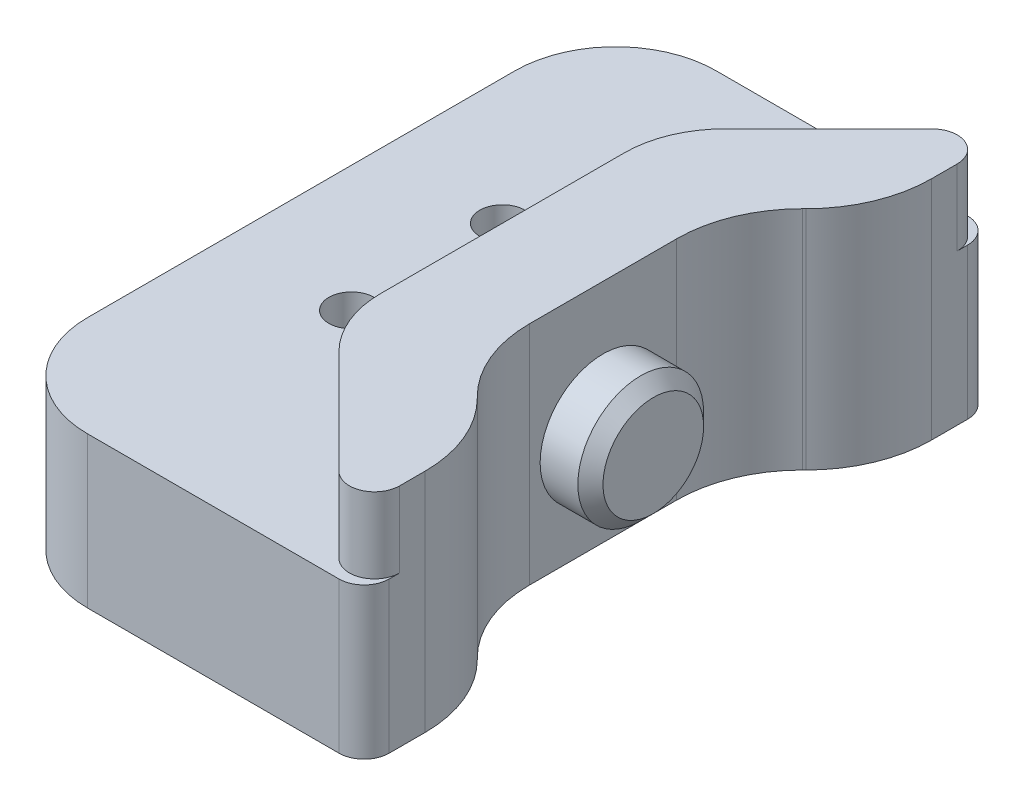
ISO-10303-21;
HEADER;
FILE_DESCRIPTION(('STEP AP214'),'2;1');
FILE_NAME('part.step','',(''),(''),'','','');
FILE_SCHEMA(('AUTOMOTIVE_DESIGN { 1 0 10303 214 1 1 1 1 }'));
ENDSEC;
DATA;
#1=APPLICATION_CONTEXT('core data for automotive mechanical design processes');
#2=APPLICATION_PROTOCOL_DEFINITION('international standard','automotive_design',2000,#1);
#3=PRODUCT_CONTEXT('',#1,'mechanical');
#4=PRODUCT('Part','Part','',(#3));
#5=PRODUCT_RELATED_PRODUCT_CATEGORY('part','',(#4));
#6=PRODUCT_DEFINITION_FORMATION('','',#4);
#7=PRODUCT_DEFINITION_CONTEXT('part definition',#1,'design');
#8=PRODUCT_DEFINITION('design','',#6,#7);
#9=PRODUCT_DEFINITION_SHAPE('','',#8);
#10=(LENGTH_UNIT() NAMED_UNIT(*) SI_UNIT(.MILLI.,.METRE.));
#11=(NAMED_UNIT(*) PLANE_ANGLE_UNIT() SI_UNIT($,.RADIAN.));
#12=(NAMED_UNIT(*) SI_UNIT($,.STERADIAN.) SOLID_ANGLE_UNIT());
#13=UNCERTAINTY_MEASURE_WITH_UNIT(LENGTH_MEASURE(1.E-05),#10,'distance_accuracy_value','');
#14=(GEOMETRIC_REPRESENTATION_CONTEXT(3) GLOBAL_UNCERTAINTY_ASSIGNED_CONTEXT((#13)) GLOBAL_UNIT_ASSIGNED_CONTEXT((#10,
#11,#12)) REPRESENTATION_CONTEXT('',''));
#15=CARTESIAN_POINT('',(0.,0.,0.));
#16=DIRECTION('',(0.,0.,1.));
#17=DIRECTION('',(1.,0.,0.));
#18=AXIS2_PLACEMENT_3D('',#15,#16,#17);
#19=CARTESIAN_POINT('',(0.,6.,0.));
#20=DIRECTION('',(0.,1.,0.));
#21=DIRECTION('',(0.,0.,1.));
#22=AXIS2_PLACEMENT_3D('',#19,#20,#21);
#23=PLANE('',#22);
#24=DIRECTION('',(0.,0.,-1.));
#25=VECTOR('',#24,1.);
#26=CARTESIAN_POINT('',(15.,6.,-8.));
#27=LINE('',#26,#25);
#28=CARTESIAN_POINT('',(15.,6.,-11.0857864376269));
#29=VERTEX_POINT('',#28);
#30=CARTESIAN_POINT('',(15.,6.,-11.5));
#31=VERTEX_POINT('',#30);
#32=EDGE_CURVE('E254',#29,#31,#27,.T.);
#33=ORIENTED_EDGE('',*,*,#32,.T.);
#34=CARTESIAN_POINT('',(14.,6.,-11.5));
#35=DIRECTION('',(0.,1.,0.));
#36=DIRECTION('',(0.,0.,1.));
#37=AXIS2_PLACEMENT_3D('',#34,#35,#36);
#38=CIRCLE('',#37,1.);
#39=CARTESIAN_POINT('',(14.,6.,-12.5));
#40=VERTEX_POINT('',#39);
#41=EDGE_CURVE('E325',#31,#40,#38,.T.);
#42=ORIENTED_EDGE('',*,*,#41,.T.);
#43=DIRECTION('',(-1.,0.,0.));
#44=VECTOR('',#43,1.);
#45=CARTESIAN_POINT('',(15.,6.,-12.5));
#46=LINE('',#45,#44);
#47=CARTESIAN_POINT('',(4.,6.,-12.5));
#48=VERTEX_POINT('',#47);
#49=EDGE_CURVE('E243',#40,#48,#46,.T.);
#50=ORIENTED_EDGE('',*,*,#49,.T.);
#51=CARTESIAN_POINT('',(4.,6.,-8.5));
#52=DIRECTION('',(0.,1.,0.));
#53=DIRECTION('',(0.,0.,1.));
#54=AXIS2_PLACEMENT_3D('',#51,#52,#53);
#55=CIRCLE('',#54,4.);
#56=CARTESIAN_POINT('',(0.,6.,-8.5));
#57=VERTEX_POINT('',#56);
#58=EDGE_CURVE('E290',#48,#57,#55,.T.);
#59=ORIENTED_EDGE('',*,*,#58,.T.);
#60=DIRECTION('',(0.,0.,1.));
#61=VECTOR('',#60,1.);
#62=CARTESIAN_POINT('',(0.,6.,-12.5));
#63=LINE('',#62,#61);
#64=CARTESIAN_POINT('',(0.,6.,8.5));
#65=VERTEX_POINT('',#64);
#66=EDGE_CURVE('E245',#57,#65,#63,.T.);
#67=ORIENTED_EDGE('',*,*,#66,.T.);
#68=CARTESIAN_POINT('',(4.,6.,8.5));
#69=DIRECTION('',(0.,1.,0.));
#70=DIRECTION('',(0.,0.,1.));
#71=AXIS2_PLACEMENT_3D('',#68,#69,#70);
#72=CIRCLE('',#71,4.);
#73=CARTESIAN_POINT('',(4.,6.,12.5));
#74=VERTEX_POINT('',#73);
#75=EDGE_CURVE('E288',#65,#74,#72,.T.);
#76=ORIENTED_EDGE('',*,*,#75,.T.);
#77=DIRECTION('',(1.,0.,0.));
#78=VECTOR('',#77,1.);
#79=CARTESIAN_POINT('',(0.,6.,12.5));
#80=LINE('',#79,#78);
#81=CARTESIAN_POINT('',(14.,6.,12.5));
#82=VERTEX_POINT('',#81);
#83=EDGE_CURVE('E249',#74,#82,#80,.T.);
#84=ORIENTED_EDGE('',*,*,#83,.T.);
#85=CARTESIAN_POINT('',(14.,6.,11.5));
#86=DIRECTION('',(0.,1.,0.));
#87=DIRECTION('',(0.,0.,1.));
#88=AXIS2_PLACEMENT_3D('',#85,#86,#87);
#89=CIRCLE('',#88,1.);
#90=CARTESIAN_POINT('',(15.,6.,11.5));
#91=VERTEX_POINT('',#90);
#92=EDGE_CURVE('E323',#82,#91,#89,.T.);
#93=ORIENTED_EDGE('',*,*,#92,.T.);
#94=DIRECTION('',(0.,0.,-1.));
#95=VECTOR('',#94,1.);
#96=CARTESIAN_POINT('',(15.,6.,12.5));
#97=LINE('',#96,#95);
#98=CARTESIAN_POINT('',(15.,6.,11.0857864376269));
#99=VERTEX_POINT('',#98);
#100=EDGE_CURVE('E252',#91,#99,#97,.T.);
#101=ORIENTED_EDGE('',*,*,#100,.T.);
#102=CARTESIAN_POINT('',(14.,6.,11.0857864376269));
#103=DIRECTION('',(0.,1.,0.));
#104=DIRECTION('',(0.,0.,1.));
#105=AXIS2_PLACEMENT_3D('',#102,#103,#104);
#106=CIRCLE('',#105,1.);
#107=CARTESIAN_POINT('',(13.2928932188135,6.,11.7928932188135));
#108=VERTEX_POINT('',#107);
#109=EDGE_CURVE('E222',#108,#99,#106,.T.);
#110=ORIENTED_EDGE('',*,*,#109,.F.);
#111=DIRECTION('',(0.707106781186547,0.,0.707106781186548));
#112=VECTOR('',#111,1.);
#113=CARTESIAN_POINT('',(8.,6.,6.5));
#114=LINE('',#113,#112);
#115=CARTESIAN_POINT('',(9.17157287525381,6.,7.67157287525381));
#116=VERTEX_POINT('',#115);
#117=EDGE_CURVE('E218',#116,#108,#114,.T.);
#118=ORIENTED_EDGE('',*,*,#117,.F.);
#119=CARTESIAN_POINT('',(12.,6.,4.84314575050762));
#120=DIRECTION('',(0.,1.,0.));
#121=DIRECTION('',(0.,0.,1.));
#122=AXIS2_PLACEMENT_3D('',#119,#120,#121);
#123=CIRCLE('',#122,4.);
#124=CARTESIAN_POINT('',(8.,6.,4.84314575050762));
#125=VERTEX_POINT('',#124);
#126=EDGE_CURVE('E311',#116,#125,#123,.F.);
#127=ORIENTED_EDGE('',*,*,#126,.T.);
#128=DIRECTION('',(0.,0.,1.));
#129=VECTOR('',#128,1.);
#130=CARTESIAN_POINT('',(8.,6.,-6.5));
#131=LINE('',#130,#129);
#132=CARTESIAN_POINT('',(8.,6.,-4.84314575050762));
#133=VERTEX_POINT('',#132);
#134=EDGE_CURVE('E482',#133,#125,#131,.T.);
#135=ORIENTED_EDGE('',*,*,#134,.F.);
#136=CARTESIAN_POINT('',(12.,6.,-4.84314575050762));
#137=DIRECTION('',(0.,1.,0.));
#138=DIRECTION('',(0.,0.,1.));
#139=AXIS2_PLACEMENT_3D('',#136,#137,#138);
#140=CIRCLE('',#139,4.);
#141=CARTESIAN_POINT('',(9.17157287525382,6.,-7.67157287525381));
#142=VERTEX_POINT('',#141);
#143=EDGE_CURVE('E309',#133,#142,#140,.F.);
#144=ORIENTED_EDGE('',*,*,#143,.T.);
#145=DIRECTION('',(-0.707106781186548,0.,0.707106781186547));
#146=VECTOR('',#145,1.);
#147=CARTESIAN_POINT('',(13.2928932188135,6.,-11.7928932188135));
#148=LINE('',#147,#146);
#149=CARTESIAN_POINT('',(13.2928932188135,6.,-11.7928932188135));
#150=VERTEX_POINT('',#149);
#151=EDGE_CURVE('E477',#150,#142,#148,.T.);
#152=ORIENTED_EDGE('',*,*,#151,.F.);
#153=CARTESIAN_POINT('',(14.,6.,-11.0857864376269));
#154=DIRECTION('',(0.,1.,0.));
#155=DIRECTION('',(0.,0.,-1.));
#156=AXIS2_PLACEMENT_3D('',#153,#154,#155);
#157=CIRCLE('',#156,1.);
#158=EDGE_CURVE('E475',#29,#150,#157,.T.);
#159=ORIENTED_EDGE('',*,*,#158,.F.);
#160=EDGE_LOOP('',(#33,#42,#50,#59,#67,#76,#84,#93,#101,#110,#118,#127,#135,#144,#152,#159));
#161=FACE_BOUND('',#160,.T.);
#162=CARTESIAN_POINT('',(5.,6.,3.));
#163=DIRECTION('',(0.,1.,0.));
#164=DIRECTION('',(0.,0.,1.));
#165=AXIS2_PLACEMENT_3D('',#162,#163,#164);
#166=CIRCLE('',#165,0.9);
#167=CARTESIAN_POINT('',(5.,6.,3.9));
#168=VERTEX_POINT('',#167);
#169=EDGE_CURVE('E237',#168,#168,#166,.T.);
#170=ORIENTED_EDGE('',*,*,#169,.F.);
#171=EDGE_LOOP('',(#170));
#172=FACE_BOUND('',#171,.T.);
#173=CARTESIAN_POINT('',(5.,6.,-3.));
#174=DIRECTION('',(0.,1.,0.));
#175=DIRECTION('',(0.,0.,1.));
#176=AXIS2_PLACEMENT_3D('',#173,#174,#175);
#177=CIRCLE('',#176,0.9);
#178=CARTESIAN_POINT('',(5.,6.,-2.1));
#179=VERTEX_POINT('',#178);
#180=EDGE_CURVE('E227',#179,#179,#177,.T.);
#181=ORIENTED_EDGE('',*,*,#180,.F.);
#182=EDGE_LOOP('',(#181));
#183=FACE_BOUND('',#182,.T.);
#184=ADVANCED_FACE('F34',(#161,#172,#183),#23,.T.);
#185=CARTESIAN_POINT('',(0.,0.,0.));
#186=DIRECTION('',(0.,1.,0.));
#187=DIRECTION('',(0.,0.,1.));
#188=AXIS2_PLACEMENT_3D('',#185,#186,#187);
#189=PLANE('',#188);
#190=DIRECTION('',(-0.707106781186548,0.,-0.707106781186548));
#191=VECTOR('',#190,1.);
#192=CARTESIAN_POINT('',(12.,0.,5.));
#193=LINE('',#192,#191);
#194=CARTESIAN_POINT('',(13.5355339059327,0.,6.53553390593274));
#195=VERTEX_POINT('',#194);
#196=CARTESIAN_POINT('',(13.4644660940673,0.,6.46446609406726));
#197=VERTEX_POINT('',#196);
#198=EDGE_CURVE('E267',#195,#197,#193,.T.);
#199=ORIENTED_EDGE('',*,*,#198,.F.);
#200=CARTESIAN_POINT('',(10.,0.,10.0710678118655));
#201=DIRECTION('',(0.,1.,0.));
#202=DIRECTION('',(0.,0.,1.));
#203=AXIS2_PLACEMENT_3D('',#200,#201,#202);
#204=CIRCLE('',#203,5.);
#205=CARTESIAN_POINT('',(15.,0.,10.0710678118655));
#206=VERTEX_POINT('',#205);
#207=EDGE_CURVE('E342',#195,#206,#204,.F.);
#208=ORIENTED_EDGE('',*,*,#207,.T.);
#209=DIRECTION('',(0.,0.,-1.));
#210=VECTOR('',#209,1.);
#211=CARTESIAN_POINT('',(15.,0.,12.5));
#212=LINE('',#211,#210);
#213=CARTESIAN_POINT('',(15.,0.,11.5));
#214=VERTEX_POINT('',#213);
#215=EDGE_CURVE('E265',#214,#206,#212,.T.);
#216=ORIENTED_EDGE('',*,*,#215,.F.);
#217=CARTESIAN_POINT('',(14.,0.,11.5));
#218=DIRECTION('',(0.,1.,0.));
#219=DIRECTION('',(0.,0.,1.));
#220=AXIS2_PLACEMENT_3D('',#217,#218,#219);
#221=CIRCLE('',#220,1.);
#222=CARTESIAN_POINT('',(14.,0.,12.5));
#223=VERTEX_POINT('',#222);
#224=EDGE_CURVE('E316',#214,#223,#221,.F.);
#225=ORIENTED_EDGE('',*,*,#224,.T.);
#226=DIRECTION('',(1.,0.,0.));
#227=VECTOR('',#226,1.);
#228=CARTESIAN_POINT('',(0.,0.,12.5));
#229=LINE('',#228,#227);
#230=CARTESIAN_POINT('',(4.,0.,12.5));
#231=VERTEX_POINT('',#230);
#232=EDGE_CURVE('E262',#231,#223,#229,.T.);
#233=ORIENTED_EDGE('',*,*,#232,.F.);
#234=CARTESIAN_POINT('',(4.,0.,8.5));
#235=DIRECTION('',(0.,1.,0.));
#236=DIRECTION('',(0.,0.,1.));
#237=AXIS2_PLACEMENT_3D('',#234,#235,#236);
#238=CIRCLE('',#237,4.);
#239=CARTESIAN_POINT('',(0.,0.,8.5));
#240=VERTEX_POINT('',#239);
#241=EDGE_CURVE('E280',#231,#240,#238,.F.);
#242=ORIENTED_EDGE('',*,*,#241,.T.);
#243=DIRECTION('',(0.,0.,1.));
#244=VECTOR('',#243,1.);
#245=CARTESIAN_POINT('',(0.,0.,-12.5));
#246=LINE('',#245,#244);
#247=CARTESIAN_POINT('',(0.,0.,-8.5));
#248=VERTEX_POINT('',#247);
#249=EDGE_CURVE('E259',#248,#240,#246,.T.);
#250=ORIENTED_EDGE('',*,*,#249,.F.);
#251=CARTESIAN_POINT('',(4.,0.,-8.5));
#252=DIRECTION('',(0.,1.,0.));
#253=DIRECTION('',(0.,0.,1.));
#254=AXIS2_PLACEMENT_3D('',#251,#252,#253);
#255=CIRCLE('',#254,4.);
#256=CARTESIAN_POINT('',(4.,0.,-12.5));
#257=VERTEX_POINT('',#256);
#258=EDGE_CURVE('E282',#248,#257,#255,.F.);
#259=ORIENTED_EDGE('',*,*,#258,.T.);
#260=DIRECTION('',(-1.,0.,0.));
#261=VECTOR('',#260,1.);
#262=CARTESIAN_POINT('',(15.,0.,-12.5));
#263=LINE('',#262,#261);
#264=CARTESIAN_POINT('',(14.,0.,-12.5));
#265=VERTEX_POINT('',#264);
#266=EDGE_CURVE('E240',#265,#257,#263,.T.);
#267=ORIENTED_EDGE('',*,*,#266,.F.);
#268=CARTESIAN_POINT('',(14.,0.,-11.5));
#269=DIRECTION('',(0.,1.,0.));
#270=DIRECTION('',(0.,0.,1.));
#271=AXIS2_PLACEMENT_3D('',#268,#269,#270);
#272=CIRCLE('',#271,1.);
#273=CARTESIAN_POINT('',(15.,0.,-11.5));
#274=VERTEX_POINT('',#273);
#275=EDGE_CURVE('E318',#265,#274,#272,.F.);
#276=ORIENTED_EDGE('',*,*,#275,.T.);
#277=DIRECTION('',(0.,0.,-1.));
#278=VECTOR('',#277,1.);
#279=CARTESIAN_POINT('',(15.,0.,-8.));
#280=LINE('',#279,#278);
#281=CARTESIAN_POINT('',(15.,0.,-10.0710678118655));
#282=VERTEX_POINT('',#281);
#283=EDGE_CURVE('E246',#282,#274,#280,.T.);
#284=ORIENTED_EDGE('',*,*,#283,.F.);
#285=CARTESIAN_POINT('',(10.,0.,-10.0710678118655));
#286=DIRECTION('',(0.,1.,0.));
#287=DIRECTION('',(0.,0.,1.));
#288=AXIS2_PLACEMENT_3D('',#285,#286,#287);
#289=CIRCLE('',#288,5.);
#290=CARTESIAN_POINT('',(13.5355339059327,0.,-6.53553390593274));
#291=VERTEX_POINT('',#290);
#292=EDGE_CURVE('E340',#282,#291,#289,.F.);
#293=ORIENTED_EDGE('',*,*,#292,.T.);
#294=DIRECTION('',(0.707106781186548,0.,-0.707106781186548));
#295=VECTOR('',#294,1.);
#296=CARTESIAN_POINT('',(15.,0.,-8.));
#297=LINE('',#296,#295);
#298=CARTESIAN_POINT('',(13.4644660940673,0.,-6.46446609406726));
#299=VERTEX_POINT('',#298);
#300=EDGE_CURVE('E273',#299,#291,#297,.T.);
#301=ORIENTED_EDGE('',*,*,#300,.F.);
#302=CARTESIAN_POINT('',(17.,0.,-2.92893218813452));
#303=DIRECTION('',(0.,1.,0.));
#304=DIRECTION('',(0.,0.,1.));
#305=AXIS2_PLACEMENT_3D('',#302,#303,#304);
#306=CIRCLE('',#305,5.);
#307=CARTESIAN_POINT('',(12.,0.,-2.92893218813452));
#308=VERTEX_POINT('',#307);
#309=EDGE_CURVE('E364',#299,#308,#306,.T.);
#310=ORIENTED_EDGE('',*,*,#309,.T.);
#311=DIRECTION('',(0.,0.,-1.));
#312=VECTOR('',#311,1.);
#313=CARTESIAN_POINT('',(12.,0.,-5.));
#314=LINE('',#313,#312);
#315=CARTESIAN_POINT('',(12.,0.,2.92893218813452));
#316=VERTEX_POINT('',#315);
#317=EDGE_CURVE('E270',#316,#308,#314,.T.);
#318=ORIENTED_EDGE('',*,*,#317,.F.);
#319=CARTESIAN_POINT('',(17.,0.,2.92893218813452));
#320=DIRECTION('',(0.,1.,0.));
#321=DIRECTION('',(0.,0.,1.));
#322=AXIS2_PLACEMENT_3D('',#319,#320,#321);
#323=CIRCLE('',#322,5.);
#324=EDGE_CURVE('E360',#316,#197,#323,.T.);
#325=ORIENTED_EDGE('',*,*,#324,.T.);
#326=EDGE_LOOP('',(#199,#208,#216,#225,#233,#242,#250,#259,#267,#276,#284,#293,#301,#310,#318,#325));
#327=FACE_BOUND('',#326,.T.);
#328=CARTESIAN_POINT('',(5.,0.,3.));
#329=DIRECTION('',(0.,1.,0.));
#330=DIRECTION('',(0.,0.,1.));
#331=AXIS2_PLACEMENT_3D('',#328,#329,#330);
#332=CIRCLE('',#331,0.9);
#333=CARTESIAN_POINT('',(5.,0.,3.9));
#334=VERTEX_POINT('',#333);
#335=EDGE_CURVE('E235',#334,#334,#332,.T.);
#336=ORIENTED_EDGE('',*,*,#335,.T.);
#337=EDGE_LOOP('',(#336));
#338=FACE_BOUND('',#337,.T.);
#339=CARTESIAN_POINT('',(5.,0.,-3.));
#340=DIRECTION('',(0.,1.,0.));
#341=DIRECTION('',(0.,0.,1.));
#342=AXIS2_PLACEMENT_3D('',#339,#340,#341);
#343=CIRCLE('',#342,0.9);
#344=CARTESIAN_POINT('',(5.,0.,-2.1));
#345=VERTEX_POINT('',#344);
#346=EDGE_CURVE('E223',#345,#345,#343,.T.);
#347=ORIENTED_EDGE('',*,*,#346,.T.);
#348=EDGE_LOOP('',(#347));
#349=FACE_BOUND('',#348,.T.);
#350=ADVANCED_FACE('F382',(#327,#338,#349),#189,.F.);
#351=CARTESIAN_POINT('',(15.,6.,-12.5));
#352=DIRECTION('',(0.,0.,1.));
#353=DIRECTION('',(1.,0.,0.));
#354=AXIS2_PLACEMENT_3D('',#351,#352,#353);
#355=PLANE('',#354);
#356=ORIENTED_EDGE('',*,*,#49,.F.);
#357=DIRECTION('',(0.,-1.,0.));
#358=VECTOR('',#357,1.);
#359=CARTESIAN_POINT('',(14.,6.,-12.5));
#360=LINE('',#359,#358);
#361=EDGE_CURVE('E313',#40,#265,#360,.T.);
#362=ORIENTED_EDGE('',*,*,#361,.T.);
#363=ORIENTED_EDGE('',*,*,#266,.T.);
#364=DIRECTION('',(0.,-1.,0.));
#365=VECTOR('',#364,1.);
#366=CARTESIAN_POINT('',(4.,6.,-12.5));
#367=LINE('',#366,#365);
#368=EDGE_CURVE('E285',#257,#48,#367,.F.);
#369=ORIENTED_EDGE('',*,*,#368,.T.);
#370=EDGE_LOOP('',(#356,#362,#363,#369));
#371=FACE_BOUND('',#370,.T.);
#372=ADVANCED_FACE('F388',(#371),#355,.F.);
#373=CARTESIAN_POINT('',(0.,6.,-12.5));
#374=DIRECTION('',(1.,0.,0.));
#375=DIRECTION('',(0.,0.,-1.));
#376=AXIS2_PLACEMENT_3D('',#373,#374,#375);
#377=PLANE('',#376);
#378=ORIENTED_EDGE('',*,*,#66,.F.);
#379=DIRECTION('',(0.,-1.,0.));
#380=VECTOR('',#379,1.);
#381=CARTESIAN_POINT('',(0.,6.,-8.5));
#382=LINE('',#381,#380);
#383=EDGE_CURVE('E277',#57,#248,#382,.T.);
#384=ORIENTED_EDGE('',*,*,#383,.T.);
#385=ORIENTED_EDGE('',*,*,#249,.T.);
#386=DIRECTION('',(0.,-1.,0.));
#387=VECTOR('',#386,1.);
#388=CARTESIAN_POINT('',(0.,6.,8.5));
#389=LINE('',#388,#387);
#390=EDGE_CURVE('E257',#240,#65,#389,.F.);
#391=ORIENTED_EDGE('',*,*,#390,.T.);
#392=EDGE_LOOP('',(#378,#384,#385,#391));
#393=FACE_BOUND('',#392,.T.);
#394=ADVANCED_FACE('F416',(#393),#377,.F.);
#395=CARTESIAN_POINT('',(0.,6.,12.5));
#396=DIRECTION('',(0.,0.,-1.));
#397=DIRECTION('',(-1.,0.,0.));
#398=AXIS2_PLACEMENT_3D('',#395,#396,#397);
#399=PLANE('',#398);
#400=ORIENTED_EDGE('',*,*,#232,.T.);
#401=DIRECTION('',(0.,-1.,0.));
#402=VECTOR('',#401,1.);
#403=CARTESIAN_POINT('',(14.,6.,12.5));
#404=LINE('',#403,#402);
#405=EDGE_CURVE('E330',#223,#82,#404,.F.);
#406=ORIENTED_EDGE('',*,*,#405,.T.);
#407=ORIENTED_EDGE('',*,*,#83,.F.);
#408=DIRECTION('',(0.,-1.,0.));
#409=VECTOR('',#408,1.);
#410=CARTESIAN_POINT('',(4.,6.,12.5));
#411=LINE('',#410,#409);
#412=EDGE_CURVE('E292',#74,#231,#411,.T.);
#413=ORIENTED_EDGE('',*,*,#412,.T.);
#414=EDGE_LOOP('',(#400,#406,#407,#413));
#415=FACE_BOUND('',#414,.T.);
#416=ADVANCED_FACE('F413',(#415),#399,.F.);
#417=CARTESIAN_POINT('',(15.,6.,12.5));
#418=DIRECTION('',(-1.,0.,0.));
#419=DIRECTION('',(0.,0.,1.));
#420=AXIS2_PLACEMENT_3D('',#417,#418,#419);
#421=PLANE('',#420);
#422=ORIENTED_EDGE('',*,*,#215,.T.);
#423=DIRECTION('',(0.,-1.,0.));
#424=VECTOR('',#423,1.);
#425=CARTESIAN_POINT('',(15.,6.,10.0710678118655));
#426=LINE('',#425,#424);
#427=CARTESIAN_POINT('',(15.,9.,10.0710678118655));
#428=VERTEX_POINT('',#427);
#429=EDGE_CURVE('E206',#206,#428,#426,.F.);
#430=ORIENTED_EDGE('',*,*,#429,.T.);
#431=DIRECTION('',(0.,0.,-1.));
#432=VECTOR('',#431,1.);
#433=CARTESIAN_POINT('',(15.,9.,8.));
#434=LINE('',#433,#432);
#435=CARTESIAN_POINT('',(15.,9.,11.0857864376269));
#436=VERTEX_POINT('',#435);
#437=EDGE_CURVE('E197',#436,#428,#434,.T.);
#438=ORIENTED_EDGE('',*,*,#437,.F.);
#439=DIRECTION('',(0.,-1.,0.));
#440=VECTOR('',#439,1.);
#441=CARTESIAN_POINT('',(15.,9.,11.0857864376269));
#442=LINE('',#441,#440);
#443=EDGE_CURVE('E203',#436,#99,#442,.T.);
#444=ORIENTED_EDGE('',*,*,#443,.T.);
#445=ORIENTED_EDGE('',*,*,#100,.F.);
#446=DIRECTION('',(0.,-1.,0.));
#447=VECTOR('',#446,1.);
#448=CARTESIAN_POINT('',(15.,6.,11.5));
#449=LINE('',#448,#447);
#450=EDGE_CURVE('E327',#91,#214,#449,.T.);
#451=ORIENTED_EDGE('',*,*,#450,.T.);
#452=EDGE_LOOP('',(#422,#430,#438,#444,#445,#451));
#453=FACE_BOUND('',#452,.T.);
#454=ADVANCED_FACE('F200',(#453),#421,.F.);
#455=CARTESIAN_POINT('',(12.,6.,5.));
#456=DIRECTION('',(-0.707106781186547,0.,0.707106781186548));
#457=DIRECTION('',(0.707106781186548,0.,0.707106781186547));
#458=AXIS2_PLACEMENT_3D('',#455,#456,#457);
#459=PLANE('',#458);
#460=DIRECTION('',(-0.707106781186548,0.,-0.707106781186548));
#461=VECTOR('',#460,1.);
#462=CARTESIAN_POINT('',(15.,9.,8.));
#463=LINE('',#462,#461);
#464=CARTESIAN_POINT('',(13.5355339059327,9.,6.53553390593274));
#465=VERTEX_POINT('',#464);
#466=CARTESIAN_POINT('',(13.4644660940673,9.,6.46446609406726));
#467=VERTEX_POINT('',#466);
#468=EDGE_CURVE('E208',#465,#467,#463,.T.);
#469=ORIENTED_EDGE('',*,*,#468,.F.);
#470=DIRECTION('',(0.,-1.,0.));
#471=VECTOR('',#470,1.);
#472=CARTESIAN_POINT('',(13.5355339059327,6.,6.53553390593274));
#473=LINE('',#472,#471);
#474=EDGE_CURVE('E337',#465,#195,#473,.T.);
#475=ORIENTED_EDGE('',*,*,#474,.T.);
#476=ORIENTED_EDGE('',*,*,#198,.T.);
#477=DIRECTION('',(0.,-1.,0.));
#478=VECTOR('',#477,1.);
#479=CARTESIAN_POINT('',(13.4644660940673,9.,6.46446609406726));
#480=LINE('',#479,#478);
#481=EDGE_CURVE('E335',#197,#467,#480,.F.);
#482=ORIENTED_EDGE('',*,*,#481,.T.);
#483=EDGE_LOOP('',(#469,#475,#476,#482));
#484=FACE_BOUND('',#483,.T.);
#485=ADVANCED_FACE('F406',(#484),#459,.F.);
#486=CARTESIAN_POINT('',(12.,6.,-5.));
#487=DIRECTION('',(-1.,0.,0.));
#488=DIRECTION('',(0.,0.,1.));
#489=AXIS2_PLACEMENT_3D('',#486,#487,#488);
#490=PLANE('',#489);
#491=CARTESIAN_POINT('',(12.,4.,0.));
#492=DIRECTION('',(-1.,0.,0.));
#493=DIRECTION('',(0.,0.,1.));
#494=AXIS2_PLACEMENT_3D('',#491,#492,#493);
#495=CIRCLE('',#494,2.5);
#496=CARTESIAN_POINT('',(12.,4.,2.5));
#497=VERTEX_POINT('',#496);
#498=EDGE_CURVE('E332',#497,#497,#495,.F.);
#499=ORIENTED_EDGE('',*,*,#498,.F.);
#500=EDGE_LOOP('',(#499));
#501=FACE_BOUND('',#500,.T.);
#502=DIRECTION('',(0.,0.,-1.));
#503=VECTOR('',#502,1.);
#504=CARTESIAN_POINT('',(12.,9.,5.));
#505=LINE('',#504,#503);
#506=CARTESIAN_POINT('',(12.,9.,2.92893218813452));
#507=VERTEX_POINT('',#506);
#508=CARTESIAN_POINT('',(12.,9.,-2.92893218813452));
#509=VERTEX_POINT('',#508);
#510=EDGE_CURVE('E538',#507,#509,#505,.T.);
#511=ORIENTED_EDGE('',*,*,#510,.F.);
#512=DIRECTION('',(0.,-1.,0.));
#513=VECTOR('',#512,1.);
#514=CARTESIAN_POINT('',(12.,0.,2.92893218813452));
#515=LINE('',#514,#513);
#516=EDGE_CURVE('E350',#507,#316,#515,.T.);
#517=ORIENTED_EDGE('',*,*,#516,.T.);
#518=ORIENTED_EDGE('',*,*,#317,.T.);
#519=DIRECTION('',(0.,-1.,0.));
#520=VECTOR('',#519,1.);
#521=CARTESIAN_POINT('',(12.,9.,-2.92893218813452));
#522=LINE('',#521,#520);
#523=EDGE_CURVE('E348',#308,#509,#522,.F.);
#524=ORIENTED_EDGE('',*,*,#523,.T.);
#525=EDGE_LOOP('',(#511,#517,#518,#524));
#526=FACE_BOUND('',#525,.T.);
#527=ADVANCED_FACE('F403',(#501,#526),#490,.F.);
#528=CARTESIAN_POINT('',(15.,6.,-8.));
#529=DIRECTION('',(-0.707106781186547,0.,-0.707106781186548));
#530=DIRECTION('',(-0.707106781186548,0.,0.707106781186547));
#531=AXIS2_PLACEMENT_3D('',#528,#529,#530);
#532=PLANE('',#531);
#533=ORIENTED_EDGE('',*,*,#300,.T.);
#534=DIRECTION('',(0.,-1.,0.));
#535=VECTOR('',#534,1.);
#536=CARTESIAN_POINT('',(13.5355339059327,6.,-6.53553390593274));
#537=LINE('',#536,#535);
#538=CARTESIAN_POINT('',(13.5355339059327,9.,-6.53553390593274));
#539=VERTEX_POINT('',#538);
#540=EDGE_CURVE('E57',#291,#539,#537,.F.);
#541=ORIENTED_EDGE('',*,*,#540,.T.);
#542=DIRECTION('',(0.707106781186548,0.,-0.707106781186548));
#543=VECTOR('',#542,1.);
#544=CARTESIAN_POINT('',(12.,9.,-5.));
#545=LINE('',#544,#543);
#546=CARTESIAN_POINT('',(13.4644660940673,9.,-6.46446609406726));
#547=VERTEX_POINT('',#546);
#548=EDGE_CURVE('E503',#547,#539,#545,.T.);
#549=ORIENTED_EDGE('',*,*,#548,.F.);
#550=DIRECTION('',(0.,-1.,0.));
#551=VECTOR('',#550,1.);
#552=CARTESIAN_POINT('',(13.4644660940673,0.,-6.46446609406726));
#553=LINE('',#552,#551);
#554=EDGE_CURVE('E356',#547,#299,#553,.T.);
#555=ORIENTED_EDGE('',*,*,#554,.T.);
#556=EDGE_LOOP('',(#533,#541,#549,#555));
#557=FACE_BOUND('',#556,.T.);
#558=ADVANCED_FACE('F399',(#557),#532,.F.);
#559=CARTESIAN_POINT('',(15.,6.,-8.));
#560=DIRECTION('',(-1.,0.,0.));
#561=DIRECTION('',(0.,0.,1.));
#562=AXIS2_PLACEMENT_3D('',#559,#560,#561);
#563=PLANE('',#562);
#564=DIRECTION('',(0.,0.,-1.));
#565=VECTOR('',#564,1.);
#566=CARTESIAN_POINT('',(15.,9.,-11.0857864376269));
#567=LINE('',#566,#565);
#568=CARTESIAN_POINT('',(15.,9.,-10.0710678118655));
#569=VERTEX_POINT('',#568);
#570=CARTESIAN_POINT('',(15.,9.,-11.0857864376269));
#571=VERTEX_POINT('',#570);
#572=EDGE_CURVE('E464',#569,#571,#567,.T.);
#573=ORIENTED_EDGE('',*,*,#572,.F.);
#574=DIRECTION('',(0.,-1.,0.));
#575=VECTOR('',#574,1.);
#576=CARTESIAN_POINT('',(15.,6.,-10.0710678118655));
#577=LINE('',#576,#575);
#578=EDGE_CURVE('E353',#569,#282,#577,.T.);
#579=ORIENTED_EDGE('',*,*,#578,.T.);
#580=ORIENTED_EDGE('',*,*,#283,.T.);
#581=DIRECTION('',(0.,-1.,0.));
#582=VECTOR('',#581,1.);
#583=CARTESIAN_POINT('',(15.,6.,-11.5));
#584=LINE('',#583,#582);
#585=EDGE_CURVE('E321',#274,#31,#584,.F.);
#586=ORIENTED_EDGE('',*,*,#585,.T.);
#587=ORIENTED_EDGE('',*,*,#32,.F.);
#588=DIRECTION('',(0.,-1.,0.));
#589=VECTOR('',#588,1.);
#590=CARTESIAN_POINT('',(15.,9.,-11.0857864376269));
#591=LINE('',#590,#589);
#592=EDGE_CURVE('E224',#571,#29,#591,.T.);
#593=ORIENTED_EDGE('',*,*,#592,.F.);
#594=EDGE_LOOP('',(#573,#579,#580,#586,#587,#593));
#595=FACE_BOUND('',#594,.T.);
#596=ADVANCED_FACE('F396',(#595),#563,.F.);
#597=CARTESIAN_POINT('',(5.,6.,3.));
#598=DIRECTION('',(0.,-1.,0.));
#599=DIRECTION('',(0.,0.,-1.));
#600=AXIS2_PLACEMENT_3D('',#597,#598,#599);
#601=CYLINDRICAL_SURFACE('',#600,0.9);
#602=ORIENTED_EDGE('',*,*,#169,.T.);
#603=EDGE_LOOP('',(#602));
#604=FACE_BOUND('',#603,.T.);
#605=ORIENTED_EDGE('',*,*,#335,.F.);
#606=EDGE_LOOP('',(#605));
#607=FACE_BOUND('',#606,.T.);
#608=ADVANCED_FACE('F393',(#604,#607),#601,.F.);
#609=CARTESIAN_POINT('',(5.,6.,-3.));
#610=DIRECTION('',(0.,-1.,0.));
#611=DIRECTION('',(0.,0.,-1.));
#612=AXIS2_PLACEMENT_3D('',#609,#610,#611);
#613=CYLINDRICAL_SURFACE('',#612,0.9);
#614=ORIENTED_EDGE('',*,*,#180,.T.);
#615=EDGE_LOOP('',(#614));
#616=FACE_BOUND('',#615,.T.);
#617=ORIENTED_EDGE('',*,*,#346,.F.);
#618=EDGE_LOOP('',(#617));
#619=FACE_BOUND('',#618,.T.);
#620=ADVANCED_FACE('F563',(#616,#619),#613,.F.);
#621=CARTESIAN_POINT('',(14.,9.,11.0857864376269));
#622=DIRECTION('',(0.,-1.,0.));
#623=DIRECTION('',(0.,0.,-1.));
#624=AXIS2_PLACEMENT_3D('',#621,#622,#623);
#625=CYLINDRICAL_SURFACE('',#624,1.);
#626=ORIENTED_EDGE('',*,*,#109,.T.);
#627=ORIENTED_EDGE('',*,*,#443,.F.);
#628=CARTESIAN_POINT('',(14.,9.,11.0857864376269));
#629=DIRECTION('',(0.,1.,0.));
#630=DIRECTION('',(0.,0.,1.));
#631=AXIS2_PLACEMENT_3D('',#628,#629,#630);
#632=CIRCLE('',#631,1.);
#633=CARTESIAN_POINT('',(13.2928932188135,9.,11.7928932188135));
#634=VERTEX_POINT('',#633);
#635=EDGE_CURVE('E209',#634,#436,#632,.T.);
#636=ORIENTED_EDGE('',*,*,#635,.F.);
#637=DIRECTION('',(0.,-1.,0.));
#638=VECTOR('',#637,1.);
#639=CARTESIAN_POINT('',(13.2928932188135,9.,11.7928932188135));
#640=LINE('',#639,#638);
#641=EDGE_CURVE('E490',#634,#108,#640,.T.);
#642=ORIENTED_EDGE('',*,*,#641,.T.);
#643=EDGE_LOOP('',(#626,#627,#636,#642));
#644=FACE_BOUND('',#643,.T.);
#645=ADVANCED_FACE('F220',(#644),#625,.T.);
#646=CARTESIAN_POINT('',(14.,9.,-11.0857864376269));
#647=DIRECTION('',(0.,-1.,0.));
#648=DIRECTION('',(0.,0.,-1.));
#649=AXIS2_PLACEMENT_3D('',#646,#647,#648);
#650=CYLINDRICAL_SURFACE('',#649,1.);
#651=ORIENTED_EDGE('',*,*,#158,.T.);
#652=DIRECTION('',(0.,-1.,0.));
#653=VECTOR('',#652,1.);
#654=CARTESIAN_POINT('',(13.2928932188135,9.,-11.7928932188135));
#655=LINE('',#654,#653);
#656=CARTESIAN_POINT('',(13.2928932188135,9.,-11.7928932188135));
#657=VERTEX_POINT('',#656);
#658=EDGE_CURVE('E230',#657,#150,#655,.T.);
#659=ORIENTED_EDGE('',*,*,#658,.F.);
#660=CARTESIAN_POINT('',(14.,9.,-11.0857864376269));
#661=DIRECTION('',(0.,1.,0.));
#662=DIRECTION('',(0.,0.,-1.));
#663=AXIS2_PLACEMENT_3D('',#660,#661,#662);
#664=CIRCLE('',#663,1.);
#665=EDGE_CURVE('E499',#571,#657,#664,.T.);
#666=ORIENTED_EDGE('',*,*,#665,.F.);
#667=ORIENTED_EDGE('',*,*,#592,.T.);
#668=EDGE_LOOP('',(#651,#659,#666,#667));
#669=FACE_BOUND('',#668,.T.);
#670=ADVANCED_FACE('F498',(#669),#650,.T.);
#671=CARTESIAN_POINT('',(13.2928932188135,9.,-11.7928932188135));
#672=DIRECTION('',(0.707106781186547,0.,0.707106781186548));
#673=DIRECTION('',(0.707106781186548,0.,-0.707106781186547));
#674=AXIS2_PLACEMENT_3D('',#671,#672,#673);
#675=PLANE('',#674);
#676=ORIENTED_EDGE('',*,*,#151,.T.);
#677=DIRECTION('',(0.,-1.,0.));
#678=VECTOR('',#677,1.);
#679=CARTESIAN_POINT('',(9.17157287525382,9.,-7.67157287525381));
#680=LINE('',#679,#678);
#681=CARTESIAN_POINT('',(9.17157287525382,9.,-7.67157287525381));
#682=VERTEX_POINT('',#681);
#683=EDGE_CURVE('E300',#142,#682,#680,.F.);
#684=ORIENTED_EDGE('',*,*,#683,.T.);
#685=DIRECTION('',(-0.707106781186548,0.,0.707106781186547));
#686=VECTOR('',#685,1.);
#687=CARTESIAN_POINT('',(13.2928932188135,9.,-11.7928932188135));
#688=LINE('',#687,#686);
#689=EDGE_CURVE('E496',#657,#682,#688,.T.);
#690=ORIENTED_EDGE('',*,*,#689,.F.);
#691=ORIENTED_EDGE('',*,*,#658,.T.);
#692=EDGE_LOOP('',(#676,#684,#690,#691));
#693=FACE_BOUND('',#692,.T.);
#694=ADVANCED_FACE('F493',(#693),#675,.F.);
#695=CARTESIAN_POINT('',(8.,9.,-6.5));
#696=DIRECTION('',(1.,0.,0.));
#697=DIRECTION('',(0.,0.,-1.));
#698=AXIS2_PLACEMENT_3D('',#695,#696,#697);
#699=PLANE('',#698);
#700=DIRECTION('',(0.,0.,1.));
#701=VECTOR('',#700,1.);
#702=CARTESIAN_POINT('',(8.,9.,-6.5));
#703=LINE('',#702,#701);
#704=CARTESIAN_POINT('',(8.,9.,-4.84314575050762));
#705=VERTEX_POINT('',#704);
#706=CARTESIAN_POINT('',(8.,9.,4.84314575050762));
#707=VERTEX_POINT('',#706);
#708=EDGE_CURVE('E501',#705,#707,#703,.T.);
#709=ORIENTED_EDGE('',*,*,#708,.F.);
#710=DIRECTION('',(0.,-1.,0.));
#711=VECTOR('',#710,1.);
#712=CARTESIAN_POINT('',(8.,9.,-4.84314575050762));
#713=LINE('',#712,#711);
#714=EDGE_CURVE('E297',#705,#133,#713,.T.);
#715=ORIENTED_EDGE('',*,*,#714,.T.);
#716=ORIENTED_EDGE('',*,*,#134,.T.);
#717=DIRECTION('',(0.,-1.,0.));
#718=VECTOR('',#717,1.);
#719=CARTESIAN_POINT('',(8.,9.,4.84314575050762));
#720=LINE('',#719,#718);
#721=EDGE_CURVE('E295',#125,#707,#720,.F.);
#722=ORIENTED_EDGE('',*,*,#721,.T.);
#723=EDGE_LOOP('',(#709,#715,#716,#722));
#724=FACE_BOUND('',#723,.T.);
#725=ADVANCED_FACE('F549',(#724),#699,.F.);
#726=CARTESIAN_POINT('',(8.,9.,6.5));
#727=DIRECTION('',(0.707106781186548,0.,-0.707106781186547));
#728=DIRECTION('',(-0.707106781186547,0.,-0.707106781186548));
#729=AXIS2_PLACEMENT_3D('',#726,#727,#728);
#730=PLANE('',#729);
#731=DIRECTION('',(0.707106781186547,0.,0.707106781186548));
#732=VECTOR('',#731,1.);
#733=CARTESIAN_POINT('',(8.,9.,6.5));
#734=LINE('',#733,#732);
#735=CARTESIAN_POINT('',(9.17157287525381,9.,7.67157287525381));
#736=VERTEX_POINT('',#735);
#737=EDGE_CURVE('E214',#736,#634,#734,.T.);
#738=ORIENTED_EDGE('',*,*,#737,.F.);
#739=DIRECTION('',(0.,-1.,0.));
#740=VECTOR('',#739,1.);
#741=CARTESIAN_POINT('',(9.17157287525381,9.,7.67157287525381));
#742=LINE('',#741,#740);
#743=EDGE_CURVE('E306',#736,#116,#742,.T.);
#744=ORIENTED_EDGE('',*,*,#743,.T.);
#745=ORIENTED_EDGE('',*,*,#117,.T.);
#746=ORIENTED_EDGE('',*,*,#641,.F.);
#747=EDGE_LOOP('',(#738,#744,#745,#746));
#748=FACE_BOUND('',#747,.T.);
#749=ADVANCED_FACE('F517',(#748),#730,.F.);
#750=CARTESIAN_POINT('',(14.,9.,11.0857864376269));
#751=DIRECTION('',(0.,1.,0.));
#752=DIRECTION('',(0.,0.,1.));
#753=AXIS2_PLACEMENT_3D('',#750,#751,#752);
#754=PLANE('',#753);
#755=ORIENTED_EDGE('',*,*,#437,.T.);
#756=CARTESIAN_POINT('',(10.,9.,10.0710678118655));
#757=DIRECTION('',(0.,1.,0.));
#758=DIRECTION('',(0.,0.,1.));
#759=AXIS2_PLACEMENT_3D('',#756,#757,#758);
#760=CIRCLE('',#759,5.);
#761=EDGE_CURVE('E346',#428,#465,#760,.T.);
#762=ORIENTED_EDGE('',*,*,#761,.T.);
#763=ORIENTED_EDGE('',*,*,#468,.T.);
#764=CARTESIAN_POINT('',(17.,9.,2.92893218813452));
#765=DIRECTION('',(0.,1.,0.));
#766=DIRECTION('',(0.,0.,1.));
#767=AXIS2_PLACEMENT_3D('',#764,#765,#766);
#768=CIRCLE('',#767,5.);
#769=EDGE_CURVE('E362',#467,#507,#768,.F.);
#770=ORIENTED_EDGE('',*,*,#769,.T.);
#771=ORIENTED_EDGE('',*,*,#510,.T.);
#772=CARTESIAN_POINT('',(17.,9.,-2.92893218813452));
#773=DIRECTION('',(0.,1.,0.));
#774=DIRECTION('',(0.,0.,1.));
#775=AXIS2_PLACEMENT_3D('',#772,#773,#774);
#776=CIRCLE('',#775,5.);
#777=EDGE_CURVE('E366',#509,#547,#776,.F.);
#778=ORIENTED_EDGE('',*,*,#777,.T.);
#779=ORIENTED_EDGE('',*,*,#548,.T.);
#780=CARTESIAN_POINT('',(10.,9.,-10.0710678118655));
#781=DIRECTION('',(0.,1.,0.));
#782=DIRECTION('',(0.,0.,1.));
#783=AXIS2_PLACEMENT_3D('',#780,#781,#782);
#784=CIRCLE('',#783,5.);
#785=EDGE_CURVE('E49',#539,#569,#784,.T.);
#786=ORIENTED_EDGE('',*,*,#785,.T.);
#787=ORIENTED_EDGE('',*,*,#572,.T.);
#788=ORIENTED_EDGE('',*,*,#665,.T.);
#789=ORIENTED_EDGE('',*,*,#689,.T.);
#790=CARTESIAN_POINT('',(12.,9.,-4.84314575050762));
#791=DIRECTION('',(0.,1.,0.));
#792=DIRECTION('',(0.,0.,1.));
#793=AXIS2_PLACEMENT_3D('',#790,#791,#792);
#794=CIRCLE('',#793,4.);
#795=EDGE_CURVE('E304',#682,#705,#794,.T.);
#796=ORIENTED_EDGE('',*,*,#795,.T.);
#797=ORIENTED_EDGE('',*,*,#708,.T.);
#798=CARTESIAN_POINT('',(12.,9.,4.84314575050762));
#799=DIRECTION('',(0.,1.,0.));
#800=DIRECTION('',(0.,0.,1.));
#801=AXIS2_PLACEMENT_3D('',#798,#799,#800);
#802=CIRCLE('',#801,4.);
#803=EDGE_CURVE('E302',#707,#736,#802,.T.);
#804=ORIENTED_EDGE('',*,*,#803,.T.);
#805=ORIENTED_EDGE('',*,*,#737,.T.);
#806=ORIENTED_EDGE('',*,*,#635,.T.);
#807=EDGE_LOOP('',(#755,#762,#763,#770,#771,#778,#779,#786,#787,#788,#789,#796,#797,#804,#805,#806));
#808=FACE_BOUND('',#807,.T.);
#809=ADVANCED_FACE('F212',(#808),#754,.T.);
#810=CARTESIAN_POINT('',(4.,6.,-8.5));
#811=DIRECTION('',(0.,-1.,0.));
#812=DIRECTION('',(0.,0.,-1.));
#813=AXIS2_PLACEMENT_3D('',#810,#811,#812);
#814=CYLINDRICAL_SURFACE('',#813,4.);
#815=ORIENTED_EDGE('',*,*,#58,.F.);
#816=ORIENTED_EDGE('',*,*,#368,.F.);
#817=ORIENTED_EDGE('',*,*,#258,.F.);
#818=ORIENTED_EDGE('',*,*,#383,.F.);
#819=EDGE_LOOP('',(#815,#816,#817,#818));
#820=FACE_BOUND('',#819,.T.);
#821=ADVANCED_FACE('F424',(#820),#814,.T.);
#822=CARTESIAN_POINT('',(4.,6.,8.5));
#823=DIRECTION('',(0.,-1.,0.));
#824=DIRECTION('',(0.,0.,-1.));
#825=AXIS2_PLACEMENT_3D('',#822,#823,#824);
#826=CYLINDRICAL_SURFACE('',#825,4.);
#827=ORIENTED_EDGE('',*,*,#75,.F.);
#828=ORIENTED_EDGE('',*,*,#390,.F.);
#829=ORIENTED_EDGE('',*,*,#241,.F.);
#830=ORIENTED_EDGE('',*,*,#412,.F.);
#831=EDGE_LOOP('',(#827,#828,#829,#830));
#832=FACE_BOUND('',#831,.T.);
#833=ADVANCED_FACE('F427',(#832),#826,.T.);
#834=CARTESIAN_POINT('',(12.,9.,-4.84314575050762));
#835=DIRECTION('',(0.,-1.,0.));
#836=DIRECTION('',(0.,0.,-1.));
#837=AXIS2_PLACEMENT_3D('',#834,#835,#836);
#838=CYLINDRICAL_SURFACE('',#837,4.);
#839=ORIENTED_EDGE('',*,*,#795,.F.);
#840=ORIENTED_EDGE('',*,*,#683,.F.);
#841=ORIENTED_EDGE('',*,*,#143,.F.);
#842=ORIENTED_EDGE('',*,*,#714,.F.);
#843=EDGE_LOOP('',(#839,#840,#841,#842));
#844=FACE_BOUND('',#843,.T.);
#845=ADVANCED_FACE('F431',(#844),#838,.T.);
#846=CARTESIAN_POINT('',(12.,9.,4.84314575050762));
#847=DIRECTION('',(0.,-1.,0.));
#848=DIRECTION('',(0.,0.,-1.));
#849=AXIS2_PLACEMENT_3D('',#846,#847,#848);
#850=CYLINDRICAL_SURFACE('',#849,4.);
#851=ORIENTED_EDGE('',*,*,#803,.F.);
#852=ORIENTED_EDGE('',*,*,#721,.F.);
#853=ORIENTED_EDGE('',*,*,#126,.F.);
#854=ORIENTED_EDGE('',*,*,#743,.F.);
#855=EDGE_LOOP('',(#851,#852,#853,#854));
#856=FACE_BOUND('',#855,.T.);
#857=ADVANCED_FACE('F435',(#856),#850,.T.);
#858=CARTESIAN_POINT('',(14.,6.,-11.5));
#859=DIRECTION('',(0.,-1.,0.));
#860=DIRECTION('',(0.,0.,-1.));
#861=AXIS2_PLACEMENT_3D('',#858,#859,#860);
#862=CYLINDRICAL_SURFACE('',#861,1.);
#863=ORIENTED_EDGE('',*,*,#41,.F.);
#864=ORIENTED_EDGE('',*,*,#585,.F.);
#865=ORIENTED_EDGE('',*,*,#275,.F.);
#866=ORIENTED_EDGE('',*,*,#361,.F.);
#867=EDGE_LOOP('',(#863,#864,#865,#866));
#868=FACE_BOUND('',#867,.T.);
#869=ADVANCED_FACE('F439',(#868),#862,.T.);
#870=CARTESIAN_POINT('',(14.,6.,11.5));
#871=DIRECTION('',(0.,-1.,0.));
#872=DIRECTION('',(0.,0.,-1.));
#873=AXIS2_PLACEMENT_3D('',#870,#871,#872);
#874=CYLINDRICAL_SURFACE('',#873,1.);
#875=ORIENTED_EDGE('',*,*,#92,.F.);
#876=ORIENTED_EDGE('',*,*,#405,.F.);
#877=ORIENTED_EDGE('',*,*,#224,.F.);
#878=ORIENTED_EDGE('',*,*,#450,.F.);
#879=EDGE_LOOP('',(#875,#876,#877,#878));
#880=FACE_BOUND('',#879,.T.);
#881=ADVANCED_FACE('F443',(#880),#874,.T.);
#882=CARTESIAN_POINT('',(14.,4.,0.));
#883=DIRECTION('',(-1.,0.,0.));
#884=DIRECTION('',(0.,0.,1.));
#885=AXIS2_PLACEMENT_3D('',#882,#883,#884);
#886=CYLINDRICAL_SURFACE('',#885,2.5);
#887=CARTESIAN_POINT('',(13.5,4.,0.));
#888=DIRECTION('',(1.,0.,0.));
#889=DIRECTION('',(0.,0.,-1.));
#890=AXIS2_PLACEMENT_3D('',#887,#888,#889);
#891=CIRCLE('',#890,2.5);
#892=CARTESIAN_POINT('',(13.5,4.,-2.5));
#893=VERTEX_POINT('',#892);
#894=EDGE_CURVE('E11',#893,#893,#891,.F.);
#895=ORIENTED_EDGE('',*,*,#894,.T.);
#896=EDGE_LOOP('',(#895));
#897=FACE_BOUND('',#896,.T.);
#898=ORIENTED_EDGE('',*,*,#498,.T.);
#899=EDGE_LOOP('',(#898));
#900=FACE_BOUND('',#899,.T.);
#901=ADVANCED_FACE('F447',(#897,#900),#886,.T.);
#902=CARTESIAN_POINT('',(14.,4.,0.));
#903=DIRECTION('',(1.,0.,0.));
#904=DIRECTION('',(0.,0.,-1.));
#905=AXIS2_PLACEMENT_3D('',#902,#903,#904);
#906=PLANE('',#905);
#907=CARTESIAN_POINT('',(14.,4.,0.));
#908=DIRECTION('',(1.,0.,0.));
#909=DIRECTION('',(0.,0.,-1.));
#910=AXIS2_PLACEMENT_3D('',#907,#908,#909);
#911=CIRCLE('',#910,2.);
#912=CARTESIAN_POINT('',(14.,4.,-2.));
#913=VERTEX_POINT('',#912);
#914=EDGE_CURVE('E42',#913,#913,#911,.T.);
#915=ORIENTED_EDGE('',*,*,#914,.T.);
#916=EDGE_LOOP('',(#915));
#917=FACE_BOUND('',#916,.T.);
#918=ADVANCED_FACE('F370',(#917),#906,.T.);
#919=CARTESIAN_POINT('',(10.,6.,10.0710678118655));
#920=DIRECTION('',(0.,-1.,0.));
#921=DIRECTION('',(0.,0.,-1.));
#922=AXIS2_PLACEMENT_3D('',#919,#920,#921);
#923=CYLINDRICAL_SURFACE('',#922,5.);
#924=ORIENTED_EDGE('',*,*,#761,.F.);
#925=ORIENTED_EDGE('',*,*,#429,.F.);
#926=ORIENTED_EDGE('',*,*,#207,.F.);
#927=ORIENTED_EDGE('',*,*,#474,.F.);
#928=EDGE_LOOP('',(#924,#925,#926,#927));
#929=FACE_BOUND('',#928,.T.);
#930=ADVANCED_FACE('F449',(#929),#923,.T.);
#931=CARTESIAN_POINT('',(17.,6.,2.92893218813452));
#932=DIRECTION('',(0.,1.,0.));
#933=DIRECTION('',(0.,0.,1.));
#934=AXIS2_PLACEMENT_3D('',#931,#932,#933);
#935=CYLINDRICAL_SURFACE('',#934,5.);
#936=ORIENTED_EDGE('',*,*,#769,.F.);
#937=ORIENTED_EDGE('',*,*,#481,.F.);
#938=ORIENTED_EDGE('',*,*,#324,.F.);
#939=ORIENTED_EDGE('',*,*,#516,.F.);
#940=EDGE_LOOP('',(#936,#937,#938,#939));
#941=FACE_BOUND('',#940,.T.);
#942=ADVANCED_FACE('F452',(#941),#935,.F.);
#943=CARTESIAN_POINT('',(10.,6.,-10.0710678118655));
#944=DIRECTION('',(0.,-1.,0.));
#945=DIRECTION('',(0.,0.,-1.));
#946=AXIS2_PLACEMENT_3D('',#943,#944,#945);
#947=CYLINDRICAL_SURFACE('',#946,5.);
#948=ORIENTED_EDGE('',*,*,#785,.F.);
#949=ORIENTED_EDGE('',*,*,#540,.F.);
#950=ORIENTED_EDGE('',*,*,#292,.F.);
#951=ORIENTED_EDGE('',*,*,#578,.F.);
#952=EDGE_LOOP('',(#948,#949,#950,#951));
#953=FACE_BOUND('',#952,.T.);
#954=ADVANCED_FACE('F378',(#953),#947,.T.);
#955=CARTESIAN_POINT('',(17.,6.,-2.92893218813452));
#956=DIRECTION('',(0.,1.,0.));
#957=DIRECTION('',(0.,0.,1.));
#958=AXIS2_PLACEMENT_3D('',#955,#956,#957);
#959=CYLINDRICAL_SURFACE('',#958,5.);
#960=ORIENTED_EDGE('',*,*,#777,.F.);
#961=ORIENTED_EDGE('',*,*,#523,.F.);
#962=ORIENTED_EDGE('',*,*,#309,.F.);
#963=ORIENTED_EDGE('',*,*,#554,.F.);
#964=EDGE_LOOP('',(#960,#961,#962,#963));
#965=FACE_BOUND('',#964,.T.);
#966=ADVANCED_FACE('F373',(#965),#959,.F.);
#967=CARTESIAN_POINT('',(14.,4.,0.));
#968=DIRECTION('',(-1.,0.,0.));
#969=DIRECTION('',(0.,0.,1.));
#970=AXIS2_PLACEMENT_3D('',#967,#968,#969);
#971=CONICAL_SURFACE('',#970,2.,0.785398163397447);
#972=ORIENTED_EDGE('',*,*,#894,.F.);
#973=EDGE_LOOP('',(#972));
#974=FACE_BOUND('',#973,.T.);
#975=ORIENTED_EDGE('',*,*,#914,.F.);
#976=EDGE_LOOP('',(#975));
#977=FACE_BOUND('',#976,.T.);
#978=ADVANCED_FACE('F36',(#974,#977),#971,.T.);
#979=CLOSED_SHELL('',(#184,#350,#372,#394,#416,#454,#485,#527,#558,#596,#608,#620,#645,#670,
#694,#725,#749,#809,#821,#833,#845,#857,#869,#881,#901,#918,#930,#942,#954,#966,#978));
#980=MANIFOLD_SOLID_BREP('B2',#979);
#981=ADVANCED_BREP_SHAPE_REPRESENTATION('',(#18,#980),#14);
#982=SHAPE_DEFINITION_REPRESENTATION(#9,#981);
ENDSEC;
END-ISO-10303-21;
